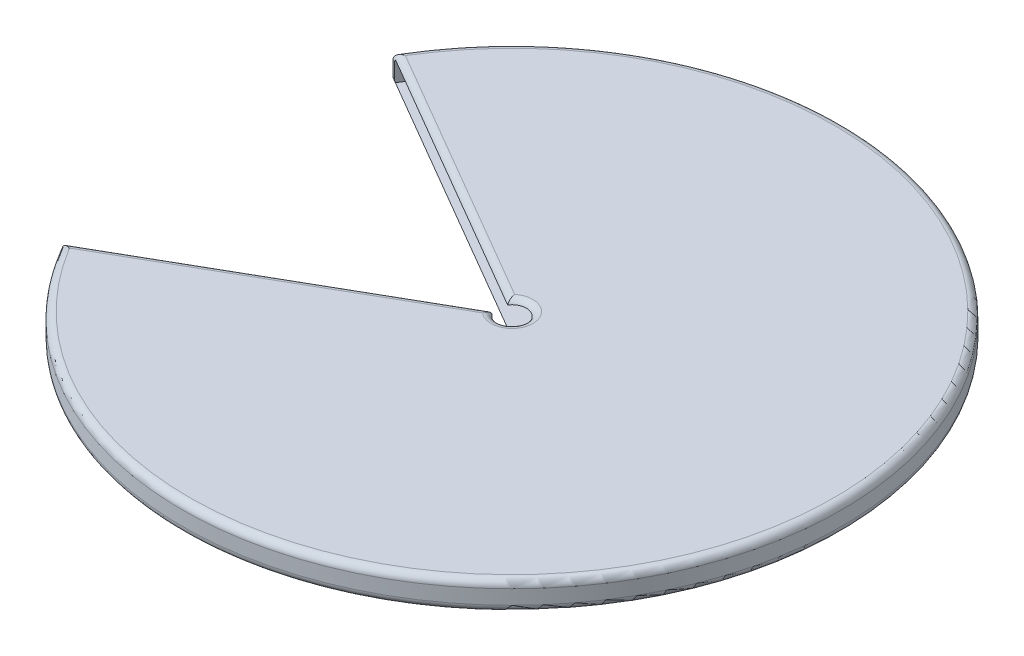
ISO-10303-21;
HEADER;
FILE_DESCRIPTION(('STEP AP214'),'2;1');
FILE_NAME('part.step','',(''),(''),'','','');
FILE_SCHEMA(('AUTOMOTIVE_DESIGN { 1 0 10303 214 1 1 1 1 }'));
ENDSEC;
DATA;
#1=APPLICATION_CONTEXT('core data for automotive mechanical design processes');
#2=APPLICATION_PROTOCOL_DEFINITION('international standard','automotive_design',2000,#1);
#3=PRODUCT_CONTEXT('',#1,'mechanical');
#4=PRODUCT('Part','Part','',(#3));
#5=PRODUCT_RELATED_PRODUCT_CATEGORY('part','',(#4));
#6=PRODUCT_DEFINITION_FORMATION('','',#4);
#7=PRODUCT_DEFINITION_CONTEXT('part definition',#1,'design');
#8=PRODUCT_DEFINITION('design','',#6,#7);
#9=PRODUCT_DEFINITION_SHAPE('','',#8);
#10=(LENGTH_UNIT() NAMED_UNIT(*) SI_UNIT(.MILLI.,.METRE.));
#11=(NAMED_UNIT(*) PLANE_ANGLE_UNIT() SI_UNIT($,.RADIAN.));
#12=(NAMED_UNIT(*) SI_UNIT($,.STERADIAN.) SOLID_ANGLE_UNIT());
#13=UNCERTAINTY_MEASURE_WITH_UNIT(LENGTH_MEASURE(1.E-05),#10,'distance_accuracy_value','');
#14=(GEOMETRIC_REPRESENTATION_CONTEXT(3) GLOBAL_UNCERTAINTY_ASSIGNED_CONTEXT((#13)) GLOBAL_UNIT_ASSIGNED_CONTEXT((#10,
#11,#12)) REPRESENTATION_CONTEXT('',''));
#15=CARTESIAN_POINT('',(0.,0.,0.));
#16=DIRECTION('',(0.,0.,1.));
#17=DIRECTION('',(1.,0.,0.));
#18=AXIS2_PLACEMENT_3D('',#15,#16,#17);
#19=CARTESIAN_POINT('',(216.357706799663,530.,-230.03098084268));
#20=DIRECTION('',(0.503098084268009,0.,-0.86422932003367));
#21=DIRECTION('',(-0.86422932003367,0.,-0.503098084268009));
#22=AXIS2_PLACEMENT_3D('',#19,#20,#21);
#23=PLANE('',#22);
#24=DIRECTION('',(0.,-1.,0.));
#25=VECTOR('',#24,1.);
#26=CARTESIAN_POINT('',(26.2272563922559,530.,-340.712559381642));
#27=LINE('',#26,#25);
#28=CARTESIAN_POINT('',(26.2272563922559,525.,-340.712559381642));
#29=VERTEX_POINT('',#28);
#30=CARTESIAN_POINT('',(26.2272563922559,515.,-340.712559381642));
#31=VERTEX_POINT('',#30);
#32=EDGE_CURVE('E156',#29,#31,#27,.T.);
#33=ORIENTED_EDGE('',*,*,#32,.T.);
#34=DIRECTION('',(0.86422932003367,0.,0.503098084268009));
#35=VECTOR('',#34,1.);
#36=CARTESIAN_POINT('',(216.357706799663,515.,-230.03098084268));
#37=LINE('',#36,#35);
#38=CARTESIAN_POINT('',(28.8199443523569,515.,-339.203265128838));
#39=VERTEX_POINT('',#38);
#40=EDGE_CURVE('E140',#31,#39,#37,.T.);
#41=ORIENTED_EDGE('',*,*,#40,.T.);
#42=DIRECTION('',(0.,-1.,0.));
#43=VECTOR('',#42,1.);
#44=CARTESIAN_POINT('',(28.8199443523569,527.,-339.203265128838));
#45=LINE('',#44,#43);
#46=CARTESIAN_POINT('',(28.8199443523569,525.,-339.203265128838));
#47=VERTEX_POINT('',#46);
#48=EDGE_CURVE('E135',#47,#39,#45,.T.);
#49=ORIENTED_EDGE('',*,*,#48,.F.);
#50=DIRECTION('',(0.86422932003367,0.,0.503098084268009));
#51=VECTOR('',#50,1.);
#52=CARTESIAN_POINT('',(26.2272563922559,525.,-340.712559381642));
#53=LINE('',#52,#51);
#54=EDGE_CURVE('E145',#47,#29,#53,.F.);
#55=ORIENTED_EDGE('',*,*,#54,.T.);
#56=EDGE_LOOP('',(#33,#41,#49,#55));
#57=FACE_BOUND('',#56,.T.);
#58=ADVANCED_FACE('F38',(#57),#23,.F.);
#59=CARTESIAN_POINT('',(216.321896184118,530.,-220.031044962895));
#60=DIRECTION('',(0.496895503710508,0.,0.867810381588214));
#61=DIRECTION('',(0.867810381588214,0.,-0.496895503710508));
#62=AXIS2_PLACEMENT_3D('',#59,#60,#61);
#63=PLANE('',#62);
#64=DIRECTION('',(0.,-1.,0.));
#65=VECTOR('',#64,1.);
#66=CARTESIAN_POINT('',(28.0070433794755,527.,-112.204720657715));
#67=LINE('',#66,#65);
#68=CARTESIAN_POINT('',(28.0070433794755,525.,-112.204720657715));
#69=VERTEX_POINT('',#68);
#70=CARTESIAN_POINT('',(28.0070433794755,515.,-112.204720657715));
#71=VERTEX_POINT('',#70);
#72=EDGE_CURVE('E149',#69,#71,#67,.T.);
#73=ORIENTED_EDGE('',*,*,#72,.T.);
#74=DIRECTION('',(-0.867810381588214,0.,0.496895503710508));
#75=VECTOR('',#74,1.);
#76=CARTESIAN_POINT('',(216.321896184118,515.,-220.031044962895));
#77=LINE('',#76,#75);
#78=CARTESIAN_POINT('',(25.4036122347108,515.,-110.714034146583));
#79=VERTEX_POINT('',#78);
#80=EDGE_CURVE('E282',#71,#79,#77,.T.);
#81=ORIENTED_EDGE('',*,*,#80,.T.);
#82=DIRECTION('',(0.,-1.,0.));
#83=VECTOR('',#82,1.);
#84=CARTESIAN_POINT('',(25.4036122347108,530.,-110.714034146583));
#85=LINE('',#84,#83);
#86=CARTESIAN_POINT('',(25.4036122347108,525.,-110.714034146583));
#87=VERTEX_POINT('',#86);
#88=EDGE_CURVE('E148',#87,#79,#85,.T.);
#89=ORIENTED_EDGE('',*,*,#88,.F.);
#90=DIRECTION('',(-0.867810381588214,0.,0.496895503710508));
#91=VECTOR('',#90,1.);
#92=CARTESIAN_POINT('',(216.321896184118,525.,-220.031044962895));
#93=LINE('',#92,#91);
#94=EDGE_CURVE('E366',#87,#69,#93,.F.);
#95=ORIENTED_EDGE('',*,*,#94,.T.);
#96=EDGE_LOOP('',(#73,#81,#89,#95));
#97=FACE_BOUND('',#96,.T.);
#98=ADVANCED_FACE('F323',(#97),#63,.F.);
#99=CARTESIAN_POINT('',(225.,530.,-225.));
#100=DIRECTION('',(0.,-1.,0.));
#101=DIRECTION('',(0.,0.,-1.));
#102=AXIS2_PLACEMENT_3D('',#99,#100,#101);
#103=CYLINDRICAL_SURFACE('',#102,230.);
#104=ORIENTED_EDGE('',*,*,#88,.T.);
#105=CARTESIAN_POINT('',(225.,515.,-225.));
#106=DIRECTION('',(0.,1.,0.));
#107=DIRECTION('',(0.,0.,1.));
#108=AXIS2_PLACEMENT_3D('',#105,#106,#107);
#109=CIRCLE('',#108,230.);
#110=EDGE_CURVE('E273',#79,#31,#109,.T.);
#111=ORIENTED_EDGE('',*,*,#110,.T.);
#112=ORIENTED_EDGE('',*,*,#32,.F.);
#113=CARTESIAN_POINT('',(225.,525.,-225.));
#114=DIRECTION('',(0.,1.,0.));
#115=DIRECTION('',(0.,0.,1.));
#116=AXIS2_PLACEMENT_3D('',#113,#114,#115);
#117=CIRCLE('',#116,230.);
#118=EDGE_CURVE('E274',#29,#87,#117,.F.);
#119=ORIENTED_EDGE('',*,*,#118,.T.);
#120=EDGE_LOOP('',(#104,#111,#112,#119));
#121=FACE_BOUND('',#120,.T.);
#122=ADVANCED_FACE('F271',(#121),#103,.T.);
#123=CARTESIAN_POINT('',(225.,530.,-225.));
#124=DIRECTION('',(0.,1.,0.));
#125=DIRECTION('',(0.,0.,1.));
#126=AXIS2_PLACEMENT_3D('',#123,#124,#125);
#127=PLANE('',#126);
#128=CARTESIAN_POINT('',(225.,530.,-225.));
#129=DIRECTION('',(0.,1.,0.));
#130=DIRECTION('',(0.,0.,1.));
#131=AXIS2_PLACEMENT_3D('',#128,#129,#130);
#132=CIRCLE('',#131,14.5825756949558);
#133=CARTESIAN_POINT('',(215.676762697536,530.,-236.212883665724));
#134=VERTEX_POINT('',#133);
#135=CARTESIAN_POINT('',(215.596694281676,530.,-213.854177667536));
#136=VERTEX_POINT('',#135);
#137=EDGE_CURVE('E259',#134,#136,#132,.F.);
#138=ORIENTED_EDGE('',*,*,#137,.T.);
#139=DIRECTION('',(-0.867810381588214,0.,0.496895503710508));
#140=VECTOR('',#139,1.);
#141=CARTESIAN_POINT('',(27.8880897532633,530.,-106.374982238642));
#142=LINE('',#141,#140);
#143=CARTESIAN_POINT('',(32.2753593026008,530.,-108.887068471861));
#144=VERTEX_POINT('',#143);
#145=EDGE_CURVE('E256',#136,#144,#142,.T.);
#146=ORIENTED_EDGE('',*,*,#145,.T.);
#147=CARTESIAN_POINT('',(225.,530.,-225.));
#148=DIRECTION('',(0.,1.,0.));
#149=DIRECTION('',(0.,0.,1.));
#150=AXIS2_PLACEMENT_3D('',#147,#148,#149);
#151=CIRCLE('',#150,225.);
#152=CARTESIAN_POINT('',(33.1119120827289,530.,-342.490262215444));
#153=VERTEX_POINT('',#152);
#154=EDGE_CURVE('E288',#144,#153,#151,.T.);
#155=ORIENTED_EDGE('',*,*,#154,.T.);
#156=DIRECTION('',(0.86422932003367,0.,0.503098084268009));
#157=VECTOR('',#156,1.);
#158=CARTESIAN_POINT('',(218.873197221003,530.,-234.352127442848));
#159=LINE('',#158,#157);
#160=EDGE_CURVE('E290',#153,#134,#159,.T.);
#161=ORIENTED_EDGE('',*,*,#160,.T.);
#162=EDGE_LOOP('',(#138,#146,#155,#161));
#163=FACE_BOUND('',#162,.T.);
#164=ADVANCED_FACE('F331',(#163),#127,.T.);
#165=CARTESIAN_POINT('',(225.,510.,-225.));
#166=DIRECTION('',(0.,1.,0.));
#167=DIRECTION('',(0.,0.,1.));
#168=AXIS2_PLACEMENT_3D('',#165,#166,#167);
#169=PLANE('',#168);
#170=CARTESIAN_POINT('',(225.,510.,-225.));
#171=DIRECTION('',(0.,1.,0.));
#172=DIRECTION('',(0.,0.,1.));
#173=AXIS2_PLACEMENT_3D('',#170,#171,#172);
#174=CIRCLE('',#173,14.5825756949558);
#175=CARTESIAN_POINT('',(215.596694281676,510.,-213.854177667536));
#176=VERTEX_POINT('',#175);
#177=CARTESIAN_POINT('',(215.676762697536,510.,-236.212883665724));
#178=VERTEX_POINT('',#177);
#179=EDGE_CURVE('E361',#176,#178,#174,.T.);
#180=ORIENTED_EDGE('',*,*,#179,.T.);
#181=DIRECTION('',(0.86422932003367,0.,0.503098084268009));
#182=VECTOR('',#181,1.);
#183=CARTESIAN_POINT('',(227.51549042134,510.,-229.321146600168));
#184=LINE('',#183,#182);
#185=CARTESIAN_POINT('',(33.1119120827289,510.,-342.490262215444));
#186=VERTEX_POINT('',#185);
#187=EDGE_CURVE('E363',#178,#186,#184,.F.);
#188=ORIENTED_EDGE('',*,*,#187,.T.);
#189=CARTESIAN_POINT('',(225.,510.,-225.));
#190=DIRECTION('',(0.,1.,0.));
#191=DIRECTION('',(0.,0.,1.));
#192=AXIS2_PLACEMENT_3D('',#189,#190,#191);
#193=CIRCLE('',#192,225.);
#194=CARTESIAN_POINT('',(32.2753593026008,510.,-108.887068471861));
#195=VERTEX_POINT('',#194);
#196=EDGE_CURVE('E356',#186,#195,#193,.F.);
#197=ORIENTED_EDGE('',*,*,#196,.T.);
#198=DIRECTION('',(-0.867810381588214,0.,0.496895503710508));
#199=VECTOR('',#198,1.);
#200=CARTESIAN_POINT('',(227.484477518552,510.,-220.660948092059));
#201=LINE('',#200,#199);
#202=EDGE_CURVE('E283',#195,#176,#201,.F.);
#203=ORIENTED_EDGE('',*,*,#202,.T.);
#204=EDGE_LOOP('',(#180,#188,#197,#203));
#205=FACE_BOUND('',#204,.T.);
#206=ADVANCED_FACE('F177',(#205),#169,.F.);
#207=CARTESIAN_POINT('',(225.,530.,-225.));
#208=DIRECTION('',(0.,-1.,0.));
#209=DIRECTION('',(0.,0.,-1.));
#210=AXIS2_PLACEMENT_3D('',#207,#208,#209);
#211=CYLINDRICAL_SURFACE('',#210,227.);
#212=ORIENTED_EDGE('',*,*,#48,.T.);
#213=CARTESIAN_POINT('',(28.8199443523569,515.,-339.203265128838));
#214=CARTESIAN_POINT('',(28.8199369635912,514.858242025319,-339.203250412086));
#215=CARTESIAN_POINT('',(28.8229769176209,514.716482835665,-339.208474448892));
#216=CARTESIAN_POINT('',(28.835101898782,514.43394827133,-339.229300190337));
#217=CARTESIAN_POINT('',(28.8441886312594,514.293173185511,-339.244904822567));
#218=CARTESIAN_POINT('',(28.8681522932682,514.016047362331,-339.286039555764));
#219=CARTESIAN_POINT('',(28.8829282770109,513.87966208835,-339.311396608819));
#220=CARTESIAN_POINT('',(28.9181773014251,513.609855784182,-339.371849857805));
#221=CARTESIAN_POINT('',(28.9386480193004,513.476433569316,-339.406942082889));
#222=CARTESIAN_POINT('',(28.9722107351362,513.286651410156,-339.464432246917));
#223=CARTESIAN_POINT('',(28.9830719183524,513.228714313057,-339.483031130358));
#224=CARTESIAN_POINT('',(29.0058713380129,513.113701288641,-339.522059185866));
#225=CARTESIAN_POINT('',(29.0178091414935,513.056625025822,-339.542487622152));
#226=CARTESIAN_POINT('',(29.030281407953,513.,-339.563822365326));
#227=B_SPLINE_CURVE_WITH_KNOTS('',3,(#213,#214,#215,#216,#217,#218,#219,#220,#221,#222,#223,
#224,#225,#226),.UNSPECIFIED.,.F.,.F.,(4,2,2,2,2,2,4),(0.,0.425148925921874,0.850417805546091,
1.26846503719057,1.68634200305289,1.87173963141069,2.05706303163826),.UNSPECIFIED.);
#228=CARTESIAN_POINT('',(29.0302814079531,513.,-339.563822365326));
#229=VERTEX_POINT('',#228);
#230=EDGE_CURVE('E189',#39,#229,#227,.T.);
#231=ORIENTED_EDGE('',*,*,#230,.T.);
#232=CARTESIAN_POINT('',(225.,513.,-225.));
#233=DIRECTION('',(0.,1.,0.));
#234=DIRECTION('',(0.,0.,1.));
#235=AXIS2_PLACEMENT_3D('',#232,#233,#234);
#236=CIRCLE('',#235,227.);
#237=CARTESIAN_POINT('',(28.2147927015886,513.,-111.842666218573));
#238=VERTEX_POINT('',#237);
#239=EDGE_CURVE('E225',#238,#229,#236,.T.);
#240=ORIENTED_EDGE('',*,*,#239,.F.);
#241=CARTESIAN_POINT('',(28.2147927015885,513.,-111.842666218573));
#242=CARTESIAN_POINT('',(28.1865198414462,513.129916726977,-111.89183546801));
#243=CARTESIAN_POINT('',(28.1610327746923,513.262258819939,-111.936199649823));
#244=CARTESIAN_POINT('',(28.1157591884958,513.530845308513,-112.015054604181));
#245=CARTESIAN_POINT('',(28.0959742790032,513.667090794296,-112.049542588258));
#246=CARTESIAN_POINT('',(28.0625364110592,513.9401231625,-112.10785447923));
#247=CARTESIAN_POINT('',(28.0487850293696,514.076861562928,-112.131849530916));
#248=CARTESIAN_POINT('',(28.0270177562623,514.352134810407,-112.169841106727));
#249=CARTESIAN_POINT('',(28.0189995313294,514.49066890317,-112.183841698803));
#250=CARTESIAN_POINT('',(28.0115948262374,514.691235156903,-112.196772021716));
#251=CARTESIAN_POINT('',(28.0098879140189,514.752950566031,-112.199752896321));
#252=CARTESIAN_POINT('',(28.0076124970242,514.876441574034,-112.203726701343));
#253=CARTESIAN_POINT('',(28.0070435367014,514.938217138914,-112.204720427258));
#254=CARTESIAN_POINT('',(28.0070433794754,515.,-112.204720657715));
#255=B_SPLINE_CURVE_WITH_KNOTS('',3,(#241,#242,#243,#244,#245,#246,#247,#248,#249,#250,#251,
#252,#253,#254),.UNSPECIFIED.,.F.,.F.,(4,2,2,2,2,2,4),(0.,0.425148934878552,0.850417789187989,
1.2684650251478,1.68634201010343,1.87173963676953,2.05706302993298),.UNSPECIFIED.);
#256=EDGE_CURVE('E183',#238,#71,#255,.T.);
#257=ORIENTED_EDGE('',*,*,#256,.T.);
#258=ORIENTED_EDGE('',*,*,#72,.F.);
#259=CARTESIAN_POINT('',(28.0070433794755,525.,-112.204720657715));
#260=CARTESIAN_POINT('',(28.0070360963018,525.141757974681,-112.204735427009));
#261=CARTESIAN_POINT('',(28.0100385574079,525.283517164335,-112.199489751803));
#262=CARTESIAN_POINT('',(28.0220140720198,525.56605172867,-112.178577704446));
#263=CARTESIAN_POINT('',(28.0309888098602,525.706826814489,-112.162908392564));
#264=CARTESIAN_POINT('',(28.0546572471147,525.983952637669,-112.121603084794));
#265=CARTESIAN_POINT('',(28.0692512427117,526.120337911649,-112.09614085536));
#266=CARTESIAN_POINT('',(28.1040663922235,526.390144215818,-112.035436700646));
#267=CARTESIAN_POINT('',(28.124285251841,526.523566430684,-112.000198762746));
#268=CARTESIAN_POINT('',(28.157435357868,526.713348589844,-111.942469694465));
#269=CARTESIAN_POINT('',(28.1681630558779,526.771285686943,-111.923793499415));
#270=CARTESIAN_POINT('',(28.1906823688328,526.886298711359,-111.884603153696));
#271=CARTESIAN_POINT('',(28.2024735560951,526.943374974178,-111.864089741888));
#272=CARTESIAN_POINT('',(28.2147927015886,527.,-111.842666218573));
#273=B_SPLINE_CURVE_WITH_KNOTS('',3,(#259,#260,#261,#262,#263,#264,#265,#266,#267,#268,#269,
#270,#271,#272),.UNSPECIFIED.,.F.,.F.,(4,2,2,2,2,2,4),(0.,0.425148925921871,0.850417805545979,
1.26846503719056,1.68634200305288,1.87173963141069,2.05706303163826),.UNSPECIFIED.);
#274=CARTESIAN_POINT('',(28.2147927015885,527.,-111.842666218573));
#275=VERTEX_POINT('',#274);
#276=EDGE_CURVE('E139',#69,#275,#273,.T.);
#277=ORIENTED_EDGE('',*,*,#276,.T.);
#278=CARTESIAN_POINT('',(225.,527.,-225.));
#279=DIRECTION('',(0.,1.,0.));
#280=DIRECTION('',(0.,0.,1.));
#281=AXIS2_PLACEMENT_3D('',#278,#279,#280);
#282=CIRCLE('',#281,227.);
#283=CARTESIAN_POINT('',(29.0302814079531,527.,-339.563822365326));
#284=VERTEX_POINT('',#283);
#285=EDGE_CURVE('E136',#275,#284,#282,.T.);
#286=ORIENTED_EDGE('',*,*,#285,.T.);
#287=CARTESIAN_POINT('',(29.0302814079531,527.,-339.563822365326));
#288=CARTESIAN_POINT('',(29.0016571189935,526.870083273023,-339.514856869389));
#289=CARTESIAN_POINT('',(28.9758529662376,526.737741180061,-339.470676365767));
#290=CARTESIAN_POINT('',(28.9300157759487,526.469154691487,-339.3921476868));
#291=CARTESIAN_POINT('',(28.9099843682955,526.332909205704,-339.357802288321));
#292=CARTESIAN_POINT('',(28.8761297237021,526.0598768375,-339.299731377523));
#293=CARTESIAN_POINT('',(28.8622068402957,525.923138437072,-339.27583542972));
#294=CARTESIAN_POINT('',(28.8401680268772,525.647865189593,-339.238000727207));
#295=CARTESIAN_POINT('',(28.8320497342747,525.50933109683,-339.224057921364));
#296=CARTESIAN_POINT('',(28.8245526111278,525.308764843097,-339.211180963157));
#297=CARTESIAN_POINT('',(28.8228243934343,525.247049433969,-339.208212390042));
#298=CARTESIAN_POINT('',(28.8205205741012,525.123558425966,-339.204254983653));
#299=CARTESIAN_POINT('',(28.8199445112293,525.061782861086,-339.203265358163));
#300=CARTESIAN_POINT('',(28.8199443523569,525.,-339.203265128838));
#301=B_SPLINE_CURVE_WITH_KNOTS('',3,(#287,#288,#289,#290,#291,#292,#293,#294,#295,#296,#297,
#298,#299,#300),.UNSPECIFIED.,.F.,.F.,(4,2,2,2,2,2,4),(0.,0.4251489348788,0.850417789188104,
1.26846502514781,1.68634201010344,1.87173963676954,2.05706302993298),.UNSPECIFIED.);
#302=EDGE_CURVE('E132',#284,#47,#301,.T.);
#303=ORIENTED_EDGE('',*,*,#302,.T.);
#304=EDGE_LOOP('',(#212,#231,#240,#257,#258,#277,#286,#303));
#305=FACE_BOUND('',#304,.T.);
#306=ADVANCED_FACE('F134',(#305),#211,.F.);
#307=CARTESIAN_POINT('',(225.,527.,-225.));
#308=DIRECTION('',(0.,1.,0.));
#309=DIRECTION('',(0.,0.,1.));
#310=AXIS2_PLACEMENT_3D('',#307,#308,#309);
#311=PLANE('',#310);
#312=ORIENTED_EDGE('',*,*,#285,.F.);
#313=DIRECTION('',(0.867810381588214,0.,-0.496895503710508));
#314=VECTOR('',#313,1.);
#315=CARTESIAN_POINT('',(28.2147927015885,527.,-111.842666218573));
#316=LINE('',#315,#314);
#317=CARTESIAN_POINT('',(216.536876237121,527.,-219.673130734269));
#318=VERTEX_POINT('',#317);
#319=EDGE_CURVE('E11',#275,#318,#316,.T.);
#320=ORIENTED_EDGE('',*,*,#319,.T.);
#321=CARTESIAN_POINT('',(225.,527.,-225.));
#322=DIRECTION('',(0.,1.,0.));
#323=DIRECTION('',(0.,0.,1.));
#324=AXIS2_PLACEMENT_3D('',#321,#322,#323);
#325=CIRCLE('',#324,9.99999999999998);
#326=CARTESIAN_POINT('',(216.575244748188,527.,-230.387346187788));
#327=VERTEX_POINT('',#326);
#328=EDGE_CURVE('E62',#327,#318,#325,.F.);
#329=ORIENTED_EDGE('',*,*,#328,.F.);
#330=DIRECTION('',(-0.86422932003367,0.,-0.503098084268009));
#331=VECTOR('',#330,1.);
#332=CARTESIAN_POINT('',(216.575244748188,527.,-230.387346187788));
#333=LINE('',#332,#331);
#334=EDGE_CURVE('E52',#327,#284,#333,.T.);
#335=ORIENTED_EDGE('',*,*,#334,.T.);
#336=EDGE_LOOP('',(#312,#320,#329,#335));
#337=FACE_BOUND('',#336,.T.);
#338=ADVANCED_FACE('F176',(#337),#311,.F.);
#339=CARTESIAN_POINT('',(225.,513.,-225.));
#340=DIRECTION('',(0.,1.,0.));
#341=DIRECTION('',(0.,0.,1.));
#342=AXIS2_PLACEMENT_3D('',#339,#340,#341);
#343=PLANE('',#342);
#344=ORIENTED_EDGE('',*,*,#239,.T.);
#345=DIRECTION('',(0.86422932003367,0.,0.503098084268009));
#346=VECTOR('',#345,1.);
#347=CARTESIAN_POINT('',(29.0302814079531,513.,-339.563822365326));
#348=LINE('',#347,#346);
#349=CARTESIAN_POINT('',(216.575244748188,513.,-230.387346187788));
#350=VERTEX_POINT('',#349);
#351=EDGE_CURVE('E349',#229,#350,#348,.T.);
#352=ORIENTED_EDGE('',*,*,#351,.T.);
#353=CARTESIAN_POINT('',(225.,513.,-225.));
#354=DIRECTION('',(0.,1.,0.));
#355=DIRECTION('',(0.,0.,1.));
#356=AXIS2_PLACEMENT_3D('',#353,#354,#355);
#357=CIRCLE('',#356,9.99999999999998);
#358=CARTESIAN_POINT('',(216.536876237121,513.,-219.673130734269));
#359=VERTEX_POINT('',#358);
#360=EDGE_CURVE('E264',#350,#359,#357,.F.);
#361=ORIENTED_EDGE('',*,*,#360,.T.);
#362=DIRECTION('',(-0.867810381588214,0.,0.496895503710508));
#363=VECTOR('',#362,1.);
#364=CARTESIAN_POINT('',(216.536876237121,513.,-219.673130734269));
#365=LINE('',#364,#363);
#366=EDGE_CURVE('E352',#359,#238,#365,.T.);
#367=ORIENTED_EDGE('',*,*,#366,.T.);
#368=EDGE_LOOP('',(#344,#352,#361,#367));
#369=FACE_BOUND('',#368,.T.);
#370=ADVANCED_FACE('F201',(#369),#343,.T.);
#371=CARTESIAN_POINT('',(218.80637370267,515.,-215.691993054954));
#372=DIRECTION('',(-0.867810381588214,0.,0.496895503710508));
#373=DIRECTION('',(0.496895503710508,0.,0.867810381588214));
#374=AXIS2_PLACEMENT_3D('',#371,#372,#373);
#375=CYLINDRICAL_SURFACE('',#374,5.);
#376=CARTESIAN_POINT('',(216.536876237121,513.,-219.673130734269));
#377=CARTESIAN_POINT('',(216.516743391164,512.862556389746,-219.592472854995));
#378=CARTESIAN_POINT('',(216.495252971836,512.729588352297,-219.50482319797));
#379=CARTESIAN_POINT('',(216.450351178567,512.473102068764,-219.317508957272));
#380=CARTESIAN_POINT('',(216.426943376626,512.349567043527,-219.217866559955));
#381=CARTESIAN_POINT('',(216.379100349058,512.112824417308,-219.00900633289));
#382=CARTESIAN_POINT('',(216.354674038381,511.999546971448,-218.899865060646));
#383=CARTESIAN_POINT('',(216.305202870632,511.782268992881,-218.672748931831));
#384=CARTESIAN_POINT('',(216.280157649542,511.678274094004,-218.554768789529));
#385=CARTESIAN_POINT('',(216.224373984223,511.457560552371,-218.28420979309));
#386=CARTESIAN_POINT('',(216.1936048534,511.343135619114,-218.129760890281));
#387=CARTESIAN_POINT('',(216.13258678403,511.128178171912,-217.811490930298));
#388=CARTESIAN_POINT('',(216.102337870728,511.027646330486,-217.647669419971));
#389=CARTESIAN_POINT('',(216.01291249992,510.745948354731,-217.142871139021));
#390=CARTESIAN_POINT('',(215.95528908926,510.585562748026,-216.789666011844));
#391=CARTESIAN_POINT('',(215.87088365101,510.379243055645,-216.221858658587));
#392=CARTESIAN_POINT('',(215.841645169714,510.313944728489,-216.01428573664));
#393=CARTESIAN_POINT('',(215.785640951394,510.201349751592,-215.593832397428));
#394=CARTESIAN_POINT('',(215.758875963835,510.154058544518,-215.380950396173));
#395=CARTESIAN_POINT('',(215.708144125222,510.078063907264,-214.952472291051));
#396=CARTESIAN_POINT('',(215.684166752344,510.049288590155,-214.736890037477));
#397=CARTESIAN_POINT('',(215.638993163804,510.010482455703,-214.303785016665));
#398=CARTESIAN_POINT('',(215.617795570883,510.000442323014,-214.086263267855));
#399=CARTESIAN_POINT('',(215.59757307002,510.000004762379,-213.863865375856));
#400=CARTESIAN_POINT('',(215.59713332481,509.999999997288,-213.859021524236));
#401=CARTESIAN_POINT('',(215.596694281676,510.,-213.854177667536));
#402=B_SPLINE_CURVE_WITH_KNOTS('',3,(#376,#377,#378,#379,#380,#381,#382,#383,#384,#385,#386,
#387,#388,#389,#390,#391,#392,#393,#394,#395,#396,#397,#398,#399,#400,#401),.UNSPECIFIED.,.F.,
.F.,(4,2,2,2,2,2,2,2,2,2,2,2,4),(0.,0.481453288714868,0.962029206026432,1.43903830038051,
1.91633496337968,2.49949290996005,3.08267907534408,4.25330142749021,4.91134824552011,
5.5695938011305,6.22526808387482,6.88061627103511,6.89520758197159),.UNSPECIFIED.);
#403=EDGE_CURVE('E210',#176,#359,#402,.F.);
#404=ORIENTED_EDGE('',*,*,#403,.F.);
#405=ORIENTED_EDGE('',*,*,#202,.F.);
#406=CARTESIAN_POINT('',(25.4036122347108,515.,-110.714034146583));
#407=CARTESIAN_POINT('',(25.4035732390063,514.887977452006,-110.71404502105));
#408=CARTESIAN_POINT('',(25.4087481953228,514.775973715216,-110.712638244233));
#409=CARTESIAN_POINT('',(25.4292315639674,514.553049893086,-110.707071440169));
#410=CARTESIAN_POINT('',(25.4445321411621,514.442129037109,-110.70291354172));
#411=CARTESIAN_POINT('',(25.4848025256772,514.223168523456,-110.691972666774));
#412=CARTESIAN_POINT('',(25.5096896603338,514.115112452356,-110.685212135181));
#413=CARTESIAN_POINT('',(25.5686316971717,513.90171442991,-110.669205878595));
#414=CARTESIAN_POINT('',(25.6026878876882,513.796372862259,-110.659959804361));
#415=CARTESIAN_POINT('',(25.6792286037687,513.589417934537,-110.639187825865));
#416=CARTESIAN_POINT('',(25.7216863622699,513.487793918478,-110.627669162317));
#417=CARTESIAN_POINT('',(25.814410460505,513.288424717085,-110.602525421985));
#418=CARTESIAN_POINT('',(25.8646798873778,513.190681084519,-110.588899512436));
#419=CARTESIAN_POINT('',(26.0263020087618,512.903592590847,-110.545114551494));
#420=CARTESIAN_POINT('',(26.1483715071627,512.720645422509,-110.512074629084));
#421=CARTESIAN_POINT('',(26.4694632278905,512.303409236706,-110.425288218079));
#422=CARTESIAN_POINT('',(26.6796188160881,512.078378946577,-110.368577715984));
#423=CARTESIAN_POINT('',(27.1321305369522,511.66602591394,-110.246754802065));
#424=CARTESIAN_POINT('',(27.3745471486037,511.478775697655,-110.18162661658));
#425=CARTESIAN_POINT('',(27.8044778955619,511.192077910875,-110.066417242701));
#426=CARTESIAN_POINT('',(27.9862695754206,511.083245966587,-110.017783211148));
#427=CARTESIAN_POINT('',(28.3584146181438,510.882308112132,-109.918408669718));
#428=CARTESIAN_POINT('',(28.548771442092,510.790209040664,-109.867667308942));
#429=CARTESIAN_POINT('',(28.9361808631047,510.621994386342,-109.764598460721));
#430=CARTESIAN_POINT('',(29.133239426165,510.545893502269,-109.712269564749));
#431=CARTESIAN_POINT('',(29.5322671524572,510.40913610949,-109.606517747239));
#432=CARTESIAN_POINT('',(29.7342354589579,510.348476927161,-109.553095016824));
#433=CARTESIAN_POINT('',(30.3174158342446,510.196142325078,-109.399151905626));
#434=CARTESIAN_POINT('',(30.7032401650312,510.122726918325,-109.29768204721));
#435=CARTESIAN_POINT('',(31.4800199569961,510.024990058396,-109.094194318395));
#436=CARTESIAN_POINT('',(31.8709631878194,510.000567616698,-108.992178010796));
#437=CARTESIAN_POINT('',(32.2662332818603,510.000003265466,-108.889440321062));
#438=CARTESIAN_POINT('',(32.2707963108804,510.000000005606,-108.888254364103));
#439=CARTESIAN_POINT('',(32.2753593026008,510.,-108.887068471861));
#440=B_SPLINE_CURVE_WITH_KNOTS('',3,(#406,#407,#408,#409,#410,#411,#412,#413,#414,#415,#416,
#417,#418,#419,#420,#421,#422,#423,#424,#425,#426,#427,#428,#429,#430,#431,#432,#433,#434,#435,
#436,#437,#438,#439),.UNSPECIFIED.,.F.,.F.,(4,2,2,2,2,2,2,2,2,2,2,2,2,2,2,2,4),(0.,
0.335909680519823,0.671559739964825,1.00437777689044,1.33724260218985,1.66906352955626,
2.00101592624166,2.66573457946666,3.59996786091328,4.53597786987441,5.18734335530113,
5.838974456848,6.49120167096941,7.14331587955015,8.35687438314673,9.56792881436928,
9.58207269985724),.UNSPECIFIED.);
#441=EDGE_CURVE('E218',#79,#195,#440,.T.);
#442=ORIENTED_EDGE('',*,*,#441,.F.);
#443=ORIENTED_EDGE('',*,*,#80,.F.);
#444=ORIENTED_EDGE('',*,*,#256,.F.);
#445=ORIENTED_EDGE('',*,*,#366,.F.);
#446=EDGE_LOOP('',(#404,#405,#442,#443,#444,#445));
#447=FACE_BOUND('',#446,.T.);
#448=ADVANCED_FACE('F196',(#447),#375,.T.);
#449=CARTESIAN_POINT('',(225.,515.,-225.));
#450=DIRECTION('',(0.,1.,0.));
#451=DIRECTION('',(0.,0.,1.));
#452=AXIS2_PLACEMENT_3D('',#449,#450,#451);
#453=TOROIDAL_SURFACE('',#452,225.,5.);
#454=ORIENTED_EDGE('',*,*,#441,.T.);
#455=ORIENTED_EDGE('',*,*,#196,.F.);
#456=CARTESIAN_POINT('',(26.2272563922559,515.,-340.712559381642));
#457=CARTESIAN_POINT('',(26.2272173196678,514.887977452006,-340.712548786744));
#458=CARTESIAN_POINT('',(26.2324022187011,514.775973715216,-340.713918464044));
#459=CARTESIAN_POINT('',(26.2529249318685,514.553049893086,-340.719338421864));
#460=CARTESIAN_POINT('',(26.2682548958236,514.442129037109,-340.723386629756));
#461=CARTESIAN_POINT('',(26.3086026068746,514.223168523456,-340.734038804488));
#462=CARTESIAN_POINT('',(26.333537522675,514.115112452356,-340.740620919108));
#463=CARTESIAN_POINT('',(26.3925926858124,513.90171442991,-340.756204617748));
#464=CARTESIAN_POINT('',(26.4267142239529,513.796372862259,-340.765206541773));
#465=CARTESIAN_POINT('',(26.5034017474301,513.589417934537,-340.785429796993));
#466=CARTESIAN_POINT('',(26.545940914532,513.487793918478,-340.796644079367));
#467=CARTESIAN_POINT('',(26.6388427159882,513.288424717085,-340.821123077663));
#468=CARTESIAN_POINT('',(26.6892084433664,513.190681084519,-340.834388604219));
#469=CARTESIAN_POINT('',(26.8511400107355,512.903592590847,-340.877014892057));
#470=CARTESIAN_POINT('',(26.9734430127719,512.720645422508,-340.909179695889));
#471=CARTESIAN_POINT('',(27.2951480691123,512.303409236706,-340.993664197308));
#472=CARTESIAN_POINT('',(27.5057044322318,512.078378946577,-341.048868094349));
#473=CARTESIAN_POINT('',(27.959077052186,511.66602591394,-341.167446959881));
#474=CARTESIAN_POINT('',(28.2019538994269,511.478775697655,-341.230837268475));
#475=CARTESIAN_POINT('',(28.6326987579478,511.192077910875,-341.342964490268));
#476=CARTESIAN_POINT('',(28.8148340959007,511.083245966587,-341.390295268413));
#477=CARTESIAN_POINT('',(29.1876813219825,510.882308112132,-341.487001929564));
#478=CARTESIAN_POINT('',(29.3783966772005,510.790209040664,-341.53637863866));
#479=CARTESIAN_POINT('',(29.7665343489814,510.621994386342,-341.636670187195));
#480=CARTESIAN_POINT('',(29.9639626414749,510.545893502269,-341.687586392397));
#481=CARTESIAN_POINT('',(30.3637375361819,510.40913610949,-341.790477630209));
#482=CARTESIAN_POINT('',(30.5660832803174,510.348476927161,-341.842452477838));
#483=CARTESIAN_POINT('',(31.1503512506364,510.196142325078,-341.992214857841));
#484=CARTESIAN_POINT('',(31.5368924207572,510.122726918325,-342.09091881012));
#485=CARTESIAN_POINT('',(32.3151096846907,510.024990058396,-342.288837963056));
#486=CARTESIAN_POINT('',(32.7067735372692,510.000567616698,-342.388051688548));
#487=CARTESIAN_POINT('',(33.1027693086856,510.000003265466,-342.48795578834));
#488=CARTESIAN_POINT('',(33.1073407145884,510.000000005606,-342.489109034116));
#489=CARTESIAN_POINT('',(33.1119120827289,510.,-342.490262215444));
#490=B_SPLINE_CURVE_WITH_KNOTS('',3,(#456,#457,#458,#459,#460,#461,#462,#463,#464,#465,#466,
#467,#468,#469,#470,#471,#472,#473,#474,#475,#476,#477,#478,#479,#480,#481,#482,#483,#484,#485,
#486,#487,#488,#489),.UNSPECIFIED.,.F.,.F.,(4,2,2,2,2,2,2,2,2,2,2,2,2,2,2,2,4),(0.,
0.33590968051971,0.671559739964821,1.00437777689044,1.33724260218984,1.66906352955637,
2.00101592624192,2.66573457946667,3.59996786091329,4.53597786987459,5.18734335530129,
5.83897445684817,6.49120167096959,7.14331587955036,8.35687438314686,9.56792881436928,
9.58207269985722),.UNSPECIFIED.);
#491=EDGE_CURVE('E287',#31,#186,#490,.T.);
#492=ORIENTED_EDGE('',*,*,#491,.F.);
#493=ORIENTED_EDGE('',*,*,#110,.F.);
#494=EDGE_LOOP('',(#454,#455,#492,#493));
#495=FACE_BOUND('',#494,.T.);
#496=ADVANCED_FACE('F200',(#495),#453,.T.);
#497=CARTESIAN_POINT('',(225.,515.,-225.));
#498=DIRECTION('',(0.,1.,0.));
#499=DIRECTION('',(0.,0.,1.));
#500=AXIS2_PLACEMENT_3D('',#497,#498,#499);
#501=TOROIDAL_SURFACE('',#500,14.5825756949558,5.);
#502=ORIENTED_EDGE('',*,*,#403,.T.);
#503=ORIENTED_EDGE('',*,*,#360,.F.);
#504=CARTESIAN_POINT('',(216.575244748188,513.,-230.387346187788));
#505=CARTESIAN_POINT('',(216.555690096556,512.862556389746,-230.468146191345));
#506=CARTESIAN_POINT('',(216.534827982023,512.729588352297,-230.555947516373));
#507=CARTESIAN_POINT('',(216.491268899445,512.473102068764,-230.743578542944));
#508=CARTESIAN_POINT('',(216.468575344408,512.349567043527,-230.843386033117));
#509=CARTESIAN_POINT('',(216.422229416985,512.112824417308,-231.05258355879));
#510=CARTESIAN_POINT('',(216.39858541101,511.999546971448,-231.1618969749));
#511=CARTESIAN_POINT('',(216.350742135343,511.782268992881,-231.389361594962));
#512=CARTESIAN_POINT('',(216.326542539498,511.678274094004,-231.507518087115));
#513=CARTESIAN_POINT('',(216.272698069335,511.457560552371,-231.778469671173));
#514=CARTESIAN_POINT('',(216.243035902642,511.343135619114,-231.933134983566));
#515=CARTESIAN_POINT('',(216.184298872283,511.128178171912,-232.251833796682));
#516=CARTESIAN_POINT('',(216.155224037106,511.027646330486,-232.415867750367));
#517=CARTESIAN_POINT('',(216.069416364132,510.745948354731,-232.921293555657));
#518=CARTESIAN_POINT('',(216.01432411378,510.585562748026,-233.274902327141));
#519=CARTESIAN_POINT('',(215.933987520452,510.379243055645,-233.843299635537));
#520=CARTESIAN_POINT('',(215.906236442352,510.313944728489,-234.051076641913));
#521=CARTESIAN_POINT('',(215.853244979698,510.201349751592,-234.471920303871));
#522=CARTESIAN_POINT('',(215.828005355932,510.154058544518,-234.684988538034));
#523=CARTESIAN_POINT('',(215.78034361175,510.078063907264,-235.113818998892));
#524=CARTESIAN_POINT('',(215.757910870584,510.049288590155,-235.329567451007));
#525=CARTESIAN_POINT('',(215.715840372244,510.010482455703,-235.762984900267));
#526=CARTESIAN_POINT('',(215.696201230552,510.000442323014,-235.980652888875));
#527=CARTESIAN_POINT('',(215.677572079226,510.000004762379,-236.203189911924));
#528=CARTESIAN_POINT('',(215.677167037334,509.999999997288,-236.208036788798));
#529=CARTESIAN_POINT('',(215.676762697536,510.,-236.212883665724));
#530=B_SPLINE_CURVE_WITH_KNOTS('',3,(#504,#505,#506,#507,#508,#509,#510,#511,#512,#513,#514,
#515,#516,#517,#518,#519,#520,#521,#522,#523,#524,#525,#526,#527,#528,#529),.UNSPECIFIED.,.F.,
.F.,(4,2,2,2,2,2,2,2,2,2,2,2,4),(0.,0.481453288714877,0.962029206026441,1.43903830038048,
1.91633496337966,2.49949290996001,3.08267907534399,4.25330142749023,4.9113482455202,
5.56959380113061,6.22526808387489,6.88061627103519,6.89520758197159),.UNSPECIFIED.);
#531=EDGE_CURVE('E250',#178,#350,#530,.F.);
#532=ORIENTED_EDGE('',*,*,#531,.F.);
#533=ORIENTED_EDGE('',*,*,#179,.F.);
#534=EDGE_LOOP('',(#502,#503,#532,#533));
#535=FACE_BOUND('',#534,.T.);
#536=ADVANCED_FACE('F308',(#535),#501,.T.);
#537=CARTESIAN_POINT('',(218.873197221003,515.,-234.352127442848));
#538=DIRECTION('',(0.86422932003367,0.,0.503098084268009));
#539=DIRECTION('',(0.503098084268009,0.,-0.86422932003367));
#540=AXIS2_PLACEMENT_3D('',#537,#538,#539);
#541=CYLINDRICAL_SURFACE('',#540,5.);
#542=ORIENTED_EDGE('',*,*,#491,.T.);
#543=ORIENTED_EDGE('',*,*,#187,.F.);
#544=ORIENTED_EDGE('',*,*,#531,.T.);
#545=ORIENTED_EDGE('',*,*,#351,.F.);
#546=ORIENTED_EDGE('',*,*,#230,.F.);
#547=ORIENTED_EDGE('',*,*,#40,.F.);
#548=EDGE_LOOP('',(#542,#543,#544,#545,#546,#547));
#549=FACE_BOUND('',#548,.T.);
#550=ADVANCED_FACE('F311',(#549),#541,.T.);
#551=CARTESIAN_POINT('',(227.51549042134,525.,-229.321146600168));
#552=DIRECTION('',(-0.86422932003367,0.,-0.503098084268009));
#553=DIRECTION('',(-0.503098084268009,0.,0.86422932003367));
#554=AXIS2_PLACEMENT_3D('',#551,#552,#553);
#555=CYLINDRICAL_SURFACE('',#554,5.);
#556=ORIENTED_EDGE('',*,*,#302,.F.);
#557=ORIENTED_EDGE('',*,*,#334,.F.);
#558=CARTESIAN_POINT('',(216.575244748188,527.,-230.387346187788));
#559=CARTESIAN_POINT('',(216.555690096556,527.137443610254,-230.468146191345));
#560=CARTESIAN_POINT('',(216.534827982023,527.270411647703,-230.555947516373));
#561=CARTESIAN_POINT('',(216.491268899445,527.526897931236,-230.743578542944));
#562=CARTESIAN_POINT('',(216.468575344408,527.650432956473,-230.843386033117));
#563=CARTESIAN_POINT('',(216.422229416985,527.887175582692,-231.05258355879));
#564=CARTESIAN_POINT('',(216.39858541101,528.000453028552,-231.1618969749));
#565=CARTESIAN_POINT('',(216.350742135343,528.217731007118,-231.389361594962));
#566=CARTESIAN_POINT('',(216.326542539498,528.321725905996,-231.507518087115));
#567=CARTESIAN_POINT('',(216.272698069335,528.542439447629,-231.778469671173));
#568=CARTESIAN_POINT('',(216.243035902642,528.656864380887,-231.933134983566));
#569=CARTESIAN_POINT('',(216.184298872283,528.871821828088,-232.251833796682));
#570=CARTESIAN_POINT('',(216.155224037106,528.972353669514,-232.415867750367));
#571=CARTESIAN_POINT('',(216.069416364132,529.254051645269,-232.921293555657));
#572=CARTESIAN_POINT('',(216.01432411378,529.414437251974,-233.274902327142));
#573=CARTESIAN_POINT('',(215.933987520452,529.620756944355,-233.843299635537));
#574=CARTESIAN_POINT('',(215.906236442352,529.686055271511,-234.051076641914));
#575=CARTESIAN_POINT('',(215.853244979698,529.798650248408,-234.471920303871));
#576=CARTESIAN_POINT('',(215.828005355932,529.845941455482,-234.684988538034));
#577=CARTESIAN_POINT('',(215.78034361175,529.921936092736,-235.113818998891));
#578=CARTESIAN_POINT('',(215.757910870582,529.950711409845,-235.329567451006));
#579=CARTESIAN_POINT('',(215.715840372246,529.989517544297,-235.762984900267));
#580=CARTESIAN_POINT('',(215.696201230557,529.999557676986,-235.980652888876));
#581=CARTESIAN_POINT('',(215.677572079226,529.999995237621,-236.203189911924));
#582=CARTESIAN_POINT('',(215.677167037334,530.000000002712,-236.208036788798));
#583=CARTESIAN_POINT('',(215.676762697536,530.,-236.212883665724));
#584=B_SPLINE_CURVE_WITH_KNOTS('',3,(#558,#559,#560,#561,#562,#563,#564,#565,#566,#567,#568,
#569,#570,#571,#572,#573,#574,#575,#576,#577,#578,#579,#580,#581,#582,#583),.UNSPECIFIED.,.F.,
.F.,(4,2,2,2,2,2,2,2,2,2,2,2,4),(0.,0.481453288714781,0.962029206026294,1.43903830038023,
1.91633496337967,2.49949290996018,3.08267907534425,4.25330142749046,4.91134824552029,
5.56959380113048,6.22526808387476,6.8806162710352,6.89520758197161),.UNSPECIFIED.);
#585=EDGE_CURVE('E43',#134,#327,#584,.F.);
#586=ORIENTED_EDGE('',*,*,#585,.F.);
#587=ORIENTED_EDGE('',*,*,#160,.F.);
#588=CARTESIAN_POINT('',(26.2272563922559,525.,-340.712559381642));
#589=CARTESIAN_POINT('',(26.2272173196678,525.112022547994,-340.712548786744));
#590=CARTESIAN_POINT('',(26.2324022187011,525.224026284784,-340.713918464044));
#591=CARTESIAN_POINT('',(26.2529249318685,525.446950106914,-340.719338421864));
#592=CARTESIAN_POINT('',(26.2682548958236,525.557870962891,-340.723386629756));
#593=CARTESIAN_POINT('',(26.3086026068746,525.776831476544,-340.734038804488));
#594=CARTESIAN_POINT('',(26.333537522675,525.884887547644,-340.740620919108));
#595=CARTESIAN_POINT('',(26.3925926858124,526.09828557009,-340.756204617748));
#596=CARTESIAN_POINT('',(26.4267142239529,526.203627137741,-340.765206541773));
#597=CARTESIAN_POINT('',(26.5034017474301,526.410582065463,-340.785429796993));
#598=CARTESIAN_POINT('',(26.545940914532,526.512206081522,-340.796644079367));
#599=CARTESIAN_POINT('',(26.6388427159881,526.711575282915,-340.821123077663));
#600=CARTESIAN_POINT('',(26.6892084433663,526.809318915481,-340.834388604219));
#601=CARTESIAN_POINT('',(26.8511400107354,527.096407409153,-340.877014892056));
#602=CARTESIAN_POINT('',(26.9734430127719,527.279354577491,-340.909179695889));
#603=CARTESIAN_POINT('',(27.2951480691123,527.696590763294,-340.993664197308));
#604=CARTESIAN_POINT('',(27.5057044322318,527.921621053423,-341.048868094349));
#605=CARTESIAN_POINT('',(27.959077052186,528.33397408606,-341.167446959881));
#606=CARTESIAN_POINT('',(28.2019538994269,528.521224302345,-341.230837268475));
#607=CARTESIAN_POINT('',(28.6326987579479,528.807922089125,-341.342964490268));
#608=CARTESIAN_POINT('',(28.8148340959008,528.916754033413,-341.390295268413));
#609=CARTESIAN_POINT('',(29.1876813219826,529.117691887868,-341.487001929564));
#610=CARTESIAN_POINT('',(29.3783966772006,529.209790959336,-341.53637863866));
#611=CARTESIAN_POINT('',(29.7665343489814,529.378005613658,-341.636670187195));
#612=CARTESIAN_POINT('',(29.963962641475,529.454106497731,-341.687586392397));
#613=CARTESIAN_POINT('',(30.3637375361821,529.59086389051,-341.790477630209));
#614=CARTESIAN_POINT('',(30.5660832803176,529.651523072839,-341.842452477838));
#615=CARTESIAN_POINT('',(31.1503512506364,529.803857674922,-341.992214857841));
#616=CARTESIAN_POINT('',(31.5368924207572,529.877273081675,-342.09091881012));
#617=CARTESIAN_POINT('',(32.3151096846908,529.975009941604,-342.288837963056));
#618=CARTESIAN_POINT('',(32.7067735372696,529.999432383302,-342.388051688546));
#619=CARTESIAN_POINT('',(33.1027693086856,529.999996734534,-342.48795578834));
#620=CARTESIAN_POINT('',(33.1073407145884,529.999999994394,-342.489109034116));
#621=CARTESIAN_POINT('',(33.1119120827289,530.,-342.490262215444));
#622=B_SPLINE_CURVE_WITH_KNOTS('',3,(#588,#589,#590,#591,#592,#593,#594,#595,#596,#597,#598,
#599,#600,#601,#602,#603,#604,#605,#606,#607,#608,#609,#610,#611,#612,#613,#614,#615,#616,#617,
#618,#619,#620,#621),.UNSPECIFIED.,.F.,.F.,(4,2,2,2,2,2,2,2,2,2,2,2,2,2,2,2,4),(0.,
0.33590968051971,0.671559739964822,1.00437777689044,1.33724260218984,1.66906352955625,
2.00101592624165,2.66573457946667,3.59996786091329,4.53597786987459,5.18734335530135,
5.83897445684825,6.49120167096971,7.14331587955049,8.35687438314691,9.56792881436929,
9.58207269985722),.UNSPECIFIED.);
#623=EDGE_CURVE('E154',#29,#153,#622,.T.);
#624=ORIENTED_EDGE('',*,*,#623,.F.);
#625=ORIENTED_EDGE('',*,*,#54,.F.);
#626=EDGE_LOOP('',(#556,#557,#586,#587,#624,#625));
#627=FACE_BOUND('',#626,.T.);
#628=ADVANCED_FACE('F40',(#627),#555,.T.);
#629=CARTESIAN_POINT('',(225.,525.,-225.));
#630=DIRECTION('',(0.,1.,0.));
#631=DIRECTION('',(0.,0.,1.));
#632=AXIS2_PLACEMENT_3D('',#629,#630,#631);
#633=TOROIDAL_SURFACE('',#632,14.5825756949558,5.);
#634=ORIENTED_EDGE('',*,*,#585,.T.);
#635=ORIENTED_EDGE('',*,*,#328,.T.);
#636=CARTESIAN_POINT('',(216.536876237121,527.,-219.673130734269));
#637=CARTESIAN_POINT('',(216.516743391164,527.137443610254,-219.592472854995));
#638=CARTESIAN_POINT('',(216.495252971836,527.270411647703,-219.50482319797));
#639=CARTESIAN_POINT('',(216.450351178567,527.526897931236,-219.317508957272));
#640=CARTESIAN_POINT('',(216.426943376626,527.650432956473,-219.217866559955));
#641=CARTESIAN_POINT('',(216.379100349058,527.887175582692,-219.00900633289));
#642=CARTESIAN_POINT('',(216.354674038381,528.000453028552,-218.899865060646));
#643=CARTESIAN_POINT('',(216.305202870632,528.217731007118,-218.672748931831));
#644=CARTESIAN_POINT('',(216.280157649542,528.321725905996,-218.55476878953));
#645=CARTESIAN_POINT('',(216.224373984223,528.542439447629,-218.28420979309));
#646=CARTESIAN_POINT('',(216.1936048534,528.656864380886,-218.129760890281));
#647=CARTESIAN_POINT('',(216.13258678403,528.871821828088,-217.811490930298));
#648=CARTESIAN_POINT('',(216.102337870728,528.972353669514,-217.647669419971));
#649=CARTESIAN_POINT('',(216.01291249992,529.254051645269,-217.142871139021));
#650=CARTESIAN_POINT('',(215.95528908926,529.414437251974,-216.789666011844));
#651=CARTESIAN_POINT('',(215.87088365101,529.620756944355,-216.221858658587));
#652=CARTESIAN_POINT('',(215.841645169714,529.686055271511,-216.01428573664));
#653=CARTESIAN_POINT('',(215.785640951394,529.798650248408,-215.593832397428));
#654=CARTESIAN_POINT('',(215.758875963835,529.845941455482,-215.380950396173));
#655=CARTESIAN_POINT('',(215.708144125222,529.921936092736,-214.952472291051));
#656=CARTESIAN_POINT('',(215.684166752344,529.950711409845,-214.736890037477));
#657=CARTESIAN_POINT('',(215.638993163805,529.989517544297,-214.303785016665));
#658=CARTESIAN_POINT('',(215.617795570883,529.999557676986,-214.086263267855));
#659=CARTESIAN_POINT('',(215.59757307002,529.999995237621,-213.863865375856));
#660=CARTESIAN_POINT('',(215.59713332481,530.000000002712,-213.859021524236));
#661=CARTESIAN_POINT('',(215.596694281676,530.,-213.854177667536));
#662=B_SPLINE_CURVE_WITH_KNOTS('',3,(#636,#637,#638,#639,#640,#641,#642,#643,#644,#645,#646,
#647,#648,#649,#650,#651,#652,#653,#654,#655,#656,#657,#658,#659,#660,#661),.UNSPECIFIED.,.F.,
.F.,(4,2,2,2,2,2,2,2,2,2,2,2,4),(0.,0.481453288714898,0.962029206026411,1.43903830038025,
1.91633496337968,2.49949290996009,3.08267907534412,4.25330142749022,4.9113482455201,
5.56959380113046,6.22526808387475,6.88061627103513,6.89520758197161),.UNSPECIFIED.);
#663=EDGE_CURVE('E232',#136,#318,#662,.F.);
#664=ORIENTED_EDGE('',*,*,#663,.F.);
#665=ORIENTED_EDGE('',*,*,#137,.F.);
#666=EDGE_LOOP('',(#634,#635,#664,#665));
#667=FACE_BOUND('',#666,.T.);
#668=ADVANCED_FACE('F240',(#667),#633,.T.);
#669=CARTESIAN_POINT('',(225.,525.,-225.));
#670=DIRECTION('',(0.,1.,0.));
#671=DIRECTION('',(0.,0.,1.));
#672=AXIS2_PLACEMENT_3D('',#669,#670,#671);
#673=TOROIDAL_SURFACE('',#672,225.,5.);
#674=ORIENTED_EDGE('',*,*,#623,.T.);
#675=ORIENTED_EDGE('',*,*,#154,.F.);
#676=CARTESIAN_POINT('',(25.4036122347108,525.,-110.714034146583));
#677=CARTESIAN_POINT('',(25.4035732390063,525.112022547994,-110.71404502105));
#678=CARTESIAN_POINT('',(25.4087481953228,525.224026284784,-110.712638244233));
#679=CARTESIAN_POINT('',(25.4292315639674,525.446950106914,-110.707071440169));
#680=CARTESIAN_POINT('',(25.4445321411621,525.557870962891,-110.70291354172));
#681=CARTESIAN_POINT('',(25.4848025256772,525.776831476544,-110.691972666774));
#682=CARTESIAN_POINT('',(25.5096896603338,525.884887547644,-110.685212135181));
#683=CARTESIAN_POINT('',(25.5686316971717,526.09828557009,-110.669205878595));
#684=CARTESIAN_POINT('',(25.6026878876882,526.203627137741,-110.659959804361));
#685=CARTESIAN_POINT('',(25.6792286037687,526.410582065463,-110.639187825865));
#686=CARTESIAN_POINT('',(25.7216863622699,526.512206081522,-110.627669162317));
#687=CARTESIAN_POINT('',(25.814410460505,526.711575282915,-110.602525421985));
#688=CARTESIAN_POINT('',(25.8646798873778,526.809318915481,-110.588899512436));
#689=CARTESIAN_POINT('',(26.0263020087618,527.096407409153,-110.545114551494));
#690=CARTESIAN_POINT('',(26.1483715071627,527.279354577491,-110.512074629084));
#691=CARTESIAN_POINT('',(26.4694632278905,527.696590763294,-110.425288218079));
#692=CARTESIAN_POINT('',(26.6796188160881,527.921621053423,-110.368577715984));
#693=CARTESIAN_POINT('',(27.1321305369522,528.33397408606,-110.246754802065));
#694=CARTESIAN_POINT('',(27.3745471486037,528.521224302345,-110.18162661658));
#695=CARTESIAN_POINT('',(27.8044778955619,528.807922089125,-110.066417242701));
#696=CARTESIAN_POINT('',(27.9862695754206,528.916754033413,-110.017783211148));
#697=CARTESIAN_POINT('',(28.3584146181438,529.117691887868,-109.918408669718));
#698=CARTESIAN_POINT('',(28.548771442092,529.209790959336,-109.867667308942));
#699=CARTESIAN_POINT('',(28.9361808631047,529.378005613658,-109.764598460721));
#700=CARTESIAN_POINT('',(29.133239426165,529.454106497731,-109.712269564749));
#701=CARTESIAN_POINT('',(29.5322671524572,529.59086389051,-109.606517747239));
#702=CARTESIAN_POINT('',(29.7342354589579,529.651523072839,-109.553095016824));
#703=CARTESIAN_POINT('',(30.3174158342446,529.803857674922,-109.399151905626));
#704=CARTESIAN_POINT('',(30.7032401650312,529.877273081675,-109.29768204721));
#705=CARTESIAN_POINT('',(31.4800199569961,529.975009941604,-109.094194318395));
#706=CARTESIAN_POINT('',(31.8709631878194,529.999432383302,-108.992178010796));
#707=CARTESIAN_POINT('',(32.2662332818602,529.999996734534,-108.889440321062));
#708=CARTESIAN_POINT('',(32.2707963108804,529.999999994394,-108.888254364103));
#709=CARTESIAN_POINT('',(32.2753593026008,530.,-108.887068471861));
#710=B_SPLINE_CURVE_WITH_KNOTS('',3,(#676,#677,#678,#679,#680,#681,#682,#683,#684,#685,#686,
#687,#688,#689,#690,#691,#692,#693,#694,#695,#696,#697,#698,#699,#700,#701,#702,#703,#704,#705,
#706,#707,#708,#709),.UNSPECIFIED.,.F.,.F.,(4,2,2,2,2,2,2,2,2,2,2,2,2,2,2,2,4),(0.,
0.335909680519823,0.671559739964823,1.00437777689044,1.33724260218985,1.66906352955626,
2.00101592624165,2.66573457946666,3.59996786091328,4.53597786987442,5.18734335530113,
5.838974456848,6.4912016709694,7.14331587955013,8.35687438314671,9.56792881436926,
9.58207269985722),.UNSPECIFIED.);
#711=EDGE_CURVE('E226',#87,#144,#710,.T.);
#712=ORIENTED_EDGE('',*,*,#711,.F.);
#713=ORIENTED_EDGE('',*,*,#118,.F.);
#714=EDGE_LOOP('',(#674,#675,#712,#713));
#715=FACE_BOUND('',#714,.T.);
#716=ADVANCED_FACE('F237',(#715),#673,.T.);
#717=CARTESIAN_POINT('',(227.484477518552,525.,-220.660948092059));
#718=DIRECTION('',(0.867810381588214,0.,-0.496895503710508));
#719=DIRECTION('',(-0.496895503710508,0.,-0.867810381588214));
#720=AXIS2_PLACEMENT_3D('',#717,#718,#719);
#721=CYLINDRICAL_SURFACE('',#720,5.);
#722=ORIENTED_EDGE('',*,*,#276,.F.);
#723=ORIENTED_EDGE('',*,*,#94,.F.);
#724=ORIENTED_EDGE('',*,*,#711,.T.);
#725=ORIENTED_EDGE('',*,*,#145,.F.);
#726=ORIENTED_EDGE('',*,*,#663,.T.);
#727=ORIENTED_EDGE('',*,*,#319,.F.);
#728=EDGE_LOOP('',(#722,#723,#724,#725,#726,#727));
#729=FACE_BOUND('',#728,.T.);
#730=ADVANCED_FACE('F204',(#729),#721,.T.);
#731=CLOSED_SHELL('',(#58,#98,#122,#164,#206,#306,#338,#370,#448,#496,#536,#550,#628,#668,#716,#730));
#732=MANIFOLD_SOLID_BREP('B2',#731);
#733=ADVANCED_BREP_SHAPE_REPRESENTATION('',(#18,#732),#14);
#734=SHAPE_DEFINITION_REPRESENTATION(#9,#733);
ENDSEC;
END-ISO-10303-21;
